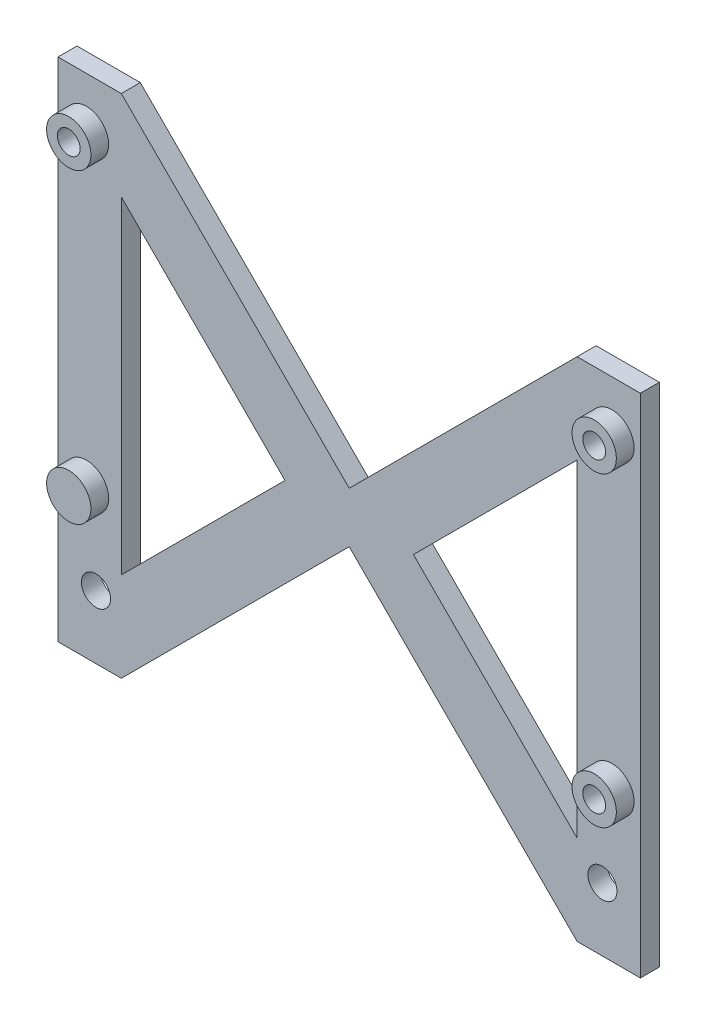
ISO-10303-21;
HEADER;
FILE_DESCRIPTION(('STEP AP214'),'2;1');
FILE_NAME('part.step','',(''),(''),'','','');
FILE_SCHEMA(('AUTOMOTIVE_DESIGN { 1 0 10303 214 1 1 1 1 }'));
ENDSEC;
DATA;
#1=APPLICATION_CONTEXT('core data for automotive mechanical design processes');
#2=APPLICATION_PROTOCOL_DEFINITION('international standard','automotive_design',2000,#1);
#3=PRODUCT_CONTEXT('',#1,'mechanical');
#4=PRODUCT('Part','Part','',(#3));
#5=PRODUCT_RELATED_PRODUCT_CATEGORY('part','',(#4));
#6=PRODUCT_DEFINITION_FORMATION('','',#4);
#7=PRODUCT_DEFINITION_CONTEXT('part definition',#1,'design');
#8=PRODUCT_DEFINITION('design','',#6,#7);
#9=PRODUCT_DEFINITION_SHAPE('','',#8);
#10=(LENGTH_UNIT() NAMED_UNIT(*) SI_UNIT(.MILLI.,.METRE.));
#11=(NAMED_UNIT(*) PLANE_ANGLE_UNIT() SI_UNIT($,.RADIAN.));
#12=(NAMED_UNIT(*) SI_UNIT($,.STERADIAN.) SOLID_ANGLE_UNIT());
#13=UNCERTAINTY_MEASURE_WITH_UNIT(LENGTH_MEASURE(1.E-05),#10,'distance_accuracy_value','');
#14=(GEOMETRIC_REPRESENTATION_CONTEXT(3) GLOBAL_UNCERTAINTY_ASSIGNED_CONTEXT((#13)) GLOBAL_UNIT_ASSIGNED_CONTEXT((#10,
#11,#12)) REPRESENTATION_CONTEXT('',''));
#15=CARTESIAN_POINT('',(0.,0.,0.));
#16=DIRECTION('',(0.,0.,1.));
#17=DIRECTION('',(1.,0.,0.));
#18=AXIS2_PLACEMENT_3D('',#15,#16,#17);
#19=CARTESIAN_POINT('',(-46.,-40.,3.));
#20=DIRECTION('',(0.,1.,0.));
#21=DIRECTION('',(0.,0.,1.));
#22=AXIS2_PLACEMENT_3D('',#19,#20,#21);
#23=PLANE('',#22);
#24=DIRECTION('',(1.,0.,0.));
#25=VECTOR('',#24,1.);
#26=CARTESIAN_POINT('',(-46.,-40.,0.));
#27=LINE('',#26,#25);
#28=CARTESIAN_POINT('',(-46.,-40.,0.));
#29=VERTEX_POINT('',#28);
#30=CARTESIAN_POINT('',(-36.,-40.,0.));
#31=VERTEX_POINT('',#30);
#32=EDGE_CURVE('E240',#29,#31,#27,.T.);
#33=ORIENTED_EDGE('',*,*,#32,.T.);
#34=DIRECTION('',(0.,0.,1.));
#35=VECTOR('',#34,1.);
#36=CARTESIAN_POINT('',(-36.,-40.,0.));
#37=LINE('',#36,#35);
#38=CARTESIAN_POINT('',(-36.,-40.,3.));
#39=VERTEX_POINT('',#38);
#40=EDGE_CURVE('E187',#31,#39,#37,.T.);
#41=ORIENTED_EDGE('',*,*,#40,.T.);
#42=DIRECTION('',(1.,0.,0.));
#43=VECTOR('',#42,1.);
#44=CARTESIAN_POINT('',(-46.,-40.,3.));
#45=LINE('',#44,#43);
#46=CARTESIAN_POINT('',(-46.,-40.,3.));
#47=VERTEX_POINT('',#46);
#48=EDGE_CURVE('E247',#47,#39,#45,.T.);
#49=ORIENTED_EDGE('',*,*,#48,.F.);
#50=DIRECTION('',(0.,0.,-1.));
#51=VECTOR('',#50,1.);
#52=CARTESIAN_POINT('',(-46.,-40.,3.));
#53=LINE('',#52,#51);
#54=EDGE_CURVE('E264',#47,#29,#53,.T.);
#55=ORIENTED_EDGE('',*,*,#54,.T.);
#56=EDGE_LOOP('',(#33,#41,#49,#55));
#57=FACE_BOUND('',#56,.T.);
#58=ADVANCED_FACE('F32',(#57),#23,.F.);
#59=CARTESIAN_POINT('',(-46.,40.,3.));
#60=DIRECTION('',(0.,-1.,0.));
#61=DIRECTION('',(0.,0.,-1.));
#62=AXIS2_PLACEMENT_3D('',#59,#60,#61);
#63=PLANE('',#62);
#64=DIRECTION('',(-1.,0.,0.));
#65=VECTOR('',#64,1.);
#66=CARTESIAN_POINT('',(-46.,40.,0.));
#67=LINE('',#66,#65);
#68=CARTESIAN_POINT('',(46.,40.,0.));
#69=VERTEX_POINT('',#68);
#70=CARTESIAN_POINT('',(36.,40.,0.));
#71=VERTEX_POINT('',#70);
#72=EDGE_CURVE('E254',#69,#71,#67,.T.);
#73=ORIENTED_EDGE('',*,*,#72,.T.);
#74=DIRECTION('',(0.,0.,1.));
#75=VECTOR('',#74,1.);
#76=CARTESIAN_POINT('',(36.,40.,0.));
#77=LINE('',#76,#75);
#78=CARTESIAN_POINT('',(36.,40.,3.));
#79=VERTEX_POINT('',#78);
#80=EDGE_CURVE('E229',#71,#79,#77,.T.);
#81=ORIENTED_EDGE('',*,*,#80,.T.);
#82=DIRECTION('',(-1.,0.,0.));
#83=VECTOR('',#82,1.);
#84=CARTESIAN_POINT('',(-46.,40.,3.));
#85=LINE('',#84,#83);
#86=CARTESIAN_POINT('',(46.,40.,3.));
#87=VERTEX_POINT('',#86);
#88=EDGE_CURVE('E241',#87,#79,#85,.T.);
#89=ORIENTED_EDGE('',*,*,#88,.F.);
#90=DIRECTION('',(0.,0.,-1.));
#91=VECTOR('',#90,1.);
#92=CARTESIAN_POINT('',(46.,40.,3.));
#93=LINE('',#92,#91);
#94=EDGE_CURVE('E270',#87,#69,#93,.T.);
#95=ORIENTED_EDGE('',*,*,#94,.T.);
#96=EDGE_LOOP('',(#73,#81,#89,#95));
#97=FACE_BOUND('',#96,.T.);
#98=ADVANCED_FACE('F324',(#97),#63,.F.);
#99=CARTESIAN_POINT('',(46.,-40.,3.));
#100=DIRECTION('',(-1.,0.,0.));
#101=DIRECTION('',(0.,0.,1.));
#102=AXIS2_PLACEMENT_3D('',#99,#100,#101);
#103=PLANE('',#102);
#104=DIRECTION('',(0.,1.,0.));
#105=VECTOR('',#104,1.);
#106=CARTESIAN_POINT('',(46.,-40.,0.));
#107=LINE('',#106,#105);
#108=CARTESIAN_POINT('',(46.,-40.,0.));
#109=VERTEX_POINT('',#108);
#110=EDGE_CURVE('E232',#109,#69,#107,.T.);
#111=ORIENTED_EDGE('',*,*,#110,.T.);
#112=ORIENTED_EDGE('',*,*,#94,.F.);
#113=DIRECTION('',(0.,1.,0.));
#114=VECTOR('',#113,1.);
#115=CARTESIAN_POINT('',(46.,-40.,3.));
#116=LINE('',#115,#114);
#117=CARTESIAN_POINT('',(46.,-40.,3.));
#118=VERTEX_POINT('',#117);
#119=EDGE_CURVE('E236',#118,#87,#116,.T.);
#120=ORIENTED_EDGE('',*,*,#119,.F.);
#121=DIRECTION('',(0.,0.,-1.));
#122=VECTOR('',#121,1.);
#123=CARTESIAN_POINT('',(46.,-40.,3.));
#124=LINE('',#123,#122);
#125=EDGE_CURVE('E250',#118,#109,#124,.T.);
#126=ORIENTED_EDGE('',*,*,#125,.T.);
#127=EDGE_LOOP('',(#111,#112,#120,#126));
#128=FACE_BOUND('',#127,.T.);
#129=ADVANCED_FACE('F34',(#128),#103,.F.);
#130=CARTESIAN_POINT('',(-36.,40.,3.));
#131=VERTEX_POINT('',#130);
#132=CARTESIAN_POINT('',(-46.,40.,3.));
#133=VERTEX_POINT('',#132);
#134=EDGE_CURVE('E239',#131,#133,#85,.T.);
#135=ORIENTED_EDGE('',*,*,#134,.F.);
#136=DIRECTION('',(0.,0.,1.));
#137=VECTOR('',#136,1.);
#138=CARTESIAN_POINT('',(-36.,40.,0.));
#139=LINE('',#138,#137);
#140=CARTESIAN_POINT('',(-36.,40.,0.));
#141=VERTEX_POINT('',#140);
#142=EDGE_CURVE('E225',#141,#131,#139,.T.);
#143=ORIENTED_EDGE('',*,*,#142,.F.);
#144=CARTESIAN_POINT('',(-46.,40.,0.));
#145=VERTEX_POINT('',#144);
#146=EDGE_CURVE('E253',#141,#145,#67,.T.);
#147=ORIENTED_EDGE('',*,*,#146,.T.);
#148=DIRECTION('',(0.,0.,-1.));
#149=VECTOR('',#148,1.);
#150=CARTESIAN_POINT('',(-46.,40.,3.));
#151=LINE('',#150,#149);
#152=EDGE_CURVE('E267',#133,#145,#151,.T.);
#153=ORIENTED_EDGE('',*,*,#152,.F.);
#154=EDGE_LOOP('',(#135,#143,#147,#153));
#155=FACE_BOUND('',#154,.T.);
#156=ADVANCED_FACE('F335',(#155),#63,.F.);
#157=CARTESIAN_POINT('',(-46.,-40.,3.));
#158=DIRECTION('',(1.,0.,0.));
#159=DIRECTION('',(0.,0.,-1.));
#160=AXIS2_PLACEMENT_3D('',#157,#158,#159);
#161=PLANE('',#160);
#162=DIRECTION('',(0.,-1.,0.));
#163=VECTOR('',#162,1.);
#164=CARTESIAN_POINT('',(-46.,-40.,0.));
#165=LINE('',#164,#163);
#166=EDGE_CURVE('E257',#145,#29,#165,.T.);
#167=ORIENTED_EDGE('',*,*,#166,.T.);
#168=ORIENTED_EDGE('',*,*,#54,.F.);
#169=DIRECTION('',(0.,-1.,0.));
#170=VECTOR('',#169,1.);
#171=CARTESIAN_POINT('',(-46.,-40.,3.));
#172=LINE('',#171,#170);
#173=EDGE_CURVE('E244',#133,#47,#172,.T.);
#174=ORIENTED_EDGE('',*,*,#173,.F.);
#175=ORIENTED_EDGE('',*,*,#152,.T.);
#176=EDGE_LOOP('',(#167,#168,#174,#175));
#177=FACE_BOUND('',#176,.T.);
#178=ADVANCED_FACE('F338',(#177),#161,.F.);
#179=CARTESIAN_POINT('',(36.,-40.,3.));
#180=VERTEX_POINT('',#179);
#181=EDGE_CURVE('E246',#180,#118,#45,.T.);
#182=ORIENTED_EDGE('',*,*,#181,.F.);
#183=DIRECTION('',(0.,0.,1.));
#184=VECTOR('',#183,1.);
#185=CARTESIAN_POINT('',(36.,-40.,0.));
#186=LINE('',#185,#184);
#187=CARTESIAN_POINT('',(36.,-40.,0.));
#188=VERTEX_POINT('',#187);
#189=EDGE_CURVE('E183',#188,#180,#186,.T.);
#190=ORIENTED_EDGE('',*,*,#189,.F.);
#191=EDGE_CURVE('E259',#188,#109,#27,.T.);
#192=ORIENTED_EDGE('',*,*,#191,.T.);
#193=ORIENTED_EDGE('',*,*,#125,.F.);
#194=EDGE_LOOP('',(#182,#190,#192,#193));
#195=FACE_BOUND('',#194,.T.);
#196=ADVANCED_FACE('F286',(#195),#23,.F.);
#197=CARTESIAN_POINT('',(0.,0.,3.));
#198=DIRECTION('',(0.,0.,-1.));
#199=DIRECTION('',(-1.,0.,0.));
#200=AXIS2_PLACEMENT_3D('',#197,#198,#199);
#201=PLANE('',#200);
#202=CARTESIAN_POINT('',(40.,-30.,3.));
#203=DIRECTION('',(0.,0.,1.));
#204=DIRECTION('',(1.,0.,0.));
#205=AXIS2_PLACEMENT_3D('',#202,#203,#204);
#206=CIRCLE('',#205,2.3);
#207=CARTESIAN_POINT('',(42.3,-30.,3.));
#208=VERTEX_POINT('',#207);
#209=EDGE_CURVE('E439',#208,#208,#206,.T.);
#210=ORIENTED_EDGE('',*,*,#209,.F.);
#211=EDGE_LOOP('',(#210));
#212=FACE_BOUND('',#211,.T.);
#213=CARTESIAN_POINT('',(-40.,-30.,3.));
#214=DIRECTION('',(0.,0.,1.));
#215=DIRECTION('',(1.,0.,0.));
#216=AXIS2_PLACEMENT_3D('',#213,#214,#215);
#217=CIRCLE('',#216,2.30000000000001);
#218=CARTESIAN_POINT('',(-37.7,-30.,3.));
#219=VERTEX_POINT('',#218);
#220=EDGE_CURVE('E441',#219,#219,#217,.T.);
#221=ORIENTED_EDGE('',*,*,#220,.F.);
#222=EDGE_LOOP('',(#221));
#223=FACE_BOUND('',#222,.T.);
#224=CARTESIAN_POINT('',(41.5,32.,3.));
#225=DIRECTION('',(0.,0.,-1.));
#226=DIRECTION('',(-1.,0.,0.));
#227=AXIS2_PLACEMENT_3D('',#224,#225,#226);
#228=CIRCLE('',#227,3.5);
#229=CARTESIAN_POINT('',(38.,32.,3.));
#230=VERTEX_POINT('',#229);
#231=EDGE_CURVE('E11',#230,#230,#228,.F.);
#232=ORIENTED_EDGE('',*,*,#231,.F.);
#233=EDGE_LOOP('',(#232));
#234=FACE_BOUND('',#233,.T.);
#235=CARTESIAN_POINT('',(41.5,-16.4,3.));
#236=DIRECTION('',(0.,0.,-1.));
#237=DIRECTION('',(-1.,0.,0.));
#238=AXIS2_PLACEMENT_3D('',#235,#236,#237);
#239=CIRCLE('',#238,3.5);
#240=CARTESIAN_POINT('',(38.,-16.4,3.));
#241=VERTEX_POINT('',#240);
#242=EDGE_CURVE('E40',#241,#241,#239,.F.);
#243=ORIENTED_EDGE('',*,*,#242,.F.);
#244=EDGE_LOOP('',(#243));
#245=FACE_BOUND('',#244,.T.);
#246=CARTESIAN_POINT('',(-41.5,-16.4,3.));
#247=DIRECTION('',(0.,0.,-1.));
#248=DIRECTION('',(-1.,0.,0.));
#249=AXIS2_PLACEMENT_3D('',#246,#247,#248);
#250=CIRCLE('',#249,3.5);
#251=CARTESIAN_POINT('',(-45.,-16.4,3.));
#252=VERTEX_POINT('',#251);
#253=EDGE_CURVE('E276',#252,#252,#250,.F.);
#254=ORIENTED_EDGE('',*,*,#253,.F.);
#255=EDGE_LOOP('',(#254));
#256=FACE_BOUND('',#255,.T.);
#257=CARTESIAN_POINT('',(-41.5,32.,3.));
#258=DIRECTION('',(0.,0.,-1.));
#259=DIRECTION('',(-1.,0.,0.));
#260=AXIS2_PLACEMENT_3D('',#257,#258,#259);
#261=CIRCLE('',#260,3.5);
#262=CARTESIAN_POINT('',(-45.,32.,3.));
#263=VERTEX_POINT('',#262);
#264=EDGE_CURVE('E273',#263,#263,#261,.F.);
#265=ORIENTED_EDGE('',*,*,#264,.F.);
#266=EDGE_LOOP('',(#265));
#267=FACE_BOUND('',#266,.T.);
#268=DIRECTION('',(0.707106781186548,-0.707106781186548,0.));
#269=VECTOR('',#268,1.);
#270=CARTESIAN_POINT('',(36.,-25.8578643762691,3.));
#271=LINE('',#270,#269);
#272=CARTESIAN_POINT('',(10.1421356237309,0.,3.));
#273=VERTEX_POINT('',#272);
#274=CARTESIAN_POINT('',(36.,-25.8578643762691,3.));
#275=VERTEX_POINT('',#274);
#276=EDGE_CURVE('E163',#273,#275,#271,.T.);
#277=ORIENTED_EDGE('',*,*,#276,.F.);
#278=DIRECTION('',(-0.707106781186547,-0.707106781186548,0.));
#279=VECTOR('',#278,1.);
#280=CARTESIAN_POINT('',(10.1421356237309,0.,3.));
#281=LINE('',#280,#279);
#282=CARTESIAN_POINT('',(36.,25.857864376269,3.));
#283=VERTEX_POINT('',#282);
#284=EDGE_CURVE('E47',#283,#273,#281,.T.);
#285=ORIENTED_EDGE('',*,*,#284,.F.);
#286=DIRECTION('',(0.,1.,0.));
#287=VECTOR('',#286,1.);
#288=CARTESIAN_POINT('',(36.,25.857864376269,3.));
#289=LINE('',#288,#287);
#290=EDGE_CURVE('E160',#275,#283,#289,.T.);
#291=ORIENTED_EDGE('',*,*,#290,.F.);
#292=EDGE_LOOP('',(#277,#285,#291));
#293=FACE_BOUND('',#292,.T.);
#294=DIRECTION('',(0.,-1.,0.));
#295=VECTOR('',#294,1.);
#296=CARTESIAN_POINT('',(-36.,25.857864376269,3.));
#297=LINE('',#296,#295);
#298=CARTESIAN_POINT('',(-36.,25.857864376269,3.));
#299=VERTEX_POINT('',#298);
#300=CARTESIAN_POINT('',(-36.,-25.857864376269,3.));
#301=VERTEX_POINT('',#300);
#302=EDGE_CURVE('E206',#299,#301,#297,.T.);
#303=ORIENTED_EDGE('',*,*,#302,.F.);
#304=DIRECTION('',(-0.707106781186548,0.707106781186547,0.));
#305=VECTOR('',#304,1.);
#306=CARTESIAN_POINT('',(-10.142135623731,0.,3.));
#307=LINE('',#306,#305);
#308=CARTESIAN_POINT('',(-10.142135623731,0.,3.));
#309=VERTEX_POINT('',#308);
#310=EDGE_CURVE('E190',#309,#299,#307,.T.);
#311=ORIENTED_EDGE('',*,*,#310,.F.);
#312=DIRECTION('',(0.707106781186548,0.707106781186548,0.));
#313=VECTOR('',#312,1.);
#314=CARTESIAN_POINT('',(-36.,-25.857864376269,3.));
#315=LINE('',#314,#313);
#316=EDGE_CURVE('E198',#301,#309,#315,.T.);
#317=ORIENTED_EDGE('',*,*,#316,.F.);
#318=EDGE_LOOP('',(#303,#311,#317));
#319=FACE_BOUND('',#318,.T.);
#320=ORIENTED_EDGE('',*,*,#48,.T.);
#321=DIRECTION('',(-0.707106781186547,-0.707106781186548,0.));
#322=VECTOR('',#321,1.);
#323=CARTESIAN_POINT('',(-36.,-40.,3.));
#324=LINE('',#323,#322);
#325=CARTESIAN_POINT('',(0.,-4.00000000000001,3.));
#326=VERTEX_POINT('',#325);
#327=EDGE_CURVE('E180',#326,#39,#324,.T.);
#328=ORIENTED_EDGE('',*,*,#327,.F.);
#329=DIRECTION('',(-0.707106781186547,0.707106781186548,0.));
#330=VECTOR('',#329,1.);
#331=CARTESIAN_POINT('',(0.,-4.00000000000001,3.));
#332=LINE('',#331,#330);
#333=EDGE_CURVE('E174',#180,#326,#332,.T.);
#334=ORIENTED_EDGE('',*,*,#333,.F.);
#335=ORIENTED_EDGE('',*,*,#181,.T.);
#336=ORIENTED_EDGE('',*,*,#119,.T.);
#337=ORIENTED_EDGE('',*,*,#88,.T.);
#338=DIRECTION('',(0.707106781186547,0.707106781186548,0.));
#339=VECTOR('',#338,1.);
#340=CARTESIAN_POINT('',(0.,3.99999999999998,3.));
#341=LINE('',#340,#339);
#342=CARTESIAN_POINT('',(0.,3.99999999999998,3.));
#343=VERTEX_POINT('',#342);
#344=EDGE_CURVE('E222',#343,#79,#341,.T.);
#345=ORIENTED_EDGE('',*,*,#344,.F.);
#346=DIRECTION('',(0.707106781186547,-0.707106781186548,0.));
#347=VECTOR('',#346,1.);
#348=CARTESIAN_POINT('',(-36.,40.,3.));
#349=LINE('',#348,#347);
#350=EDGE_CURVE('E213',#131,#343,#349,.T.);
#351=ORIENTED_EDGE('',*,*,#350,.F.);
#352=ORIENTED_EDGE('',*,*,#134,.T.);
#353=ORIENTED_EDGE('',*,*,#173,.T.);
#354=EDGE_LOOP('',(#320,#328,#334,#335,#336,#337,#345,#351,#352,#353));
#355=FACE_BOUND('',#354,.T.);
#356=ADVANCED_FACE('F283',(#212,#223,#234,#245,#256,#267,#293,#319,#355),#201,.F.);
#357=CARTESIAN_POINT('',(0.,0.,0.));
#358=DIRECTION('',(0.,0.,-1.));
#359=DIRECTION('',(-1.,0.,0.));
#360=AXIS2_PLACEMENT_3D('',#357,#358,#359);
#361=PLANE('',#360);
#362=CARTESIAN_POINT('',(40.,-30.,0.));
#363=DIRECTION('',(0.,0.,1.));
#364=DIRECTION('',(1.,0.,0.));
#365=AXIS2_PLACEMENT_3D('',#362,#363,#364);
#366=CIRCLE('',#365,2.3);
#367=CARTESIAN_POINT('',(42.3,-30.,0.));
#368=VERTEX_POINT('',#367);
#369=EDGE_CURVE('E436',#368,#368,#366,.T.);
#370=ORIENTED_EDGE('',*,*,#369,.T.);
#371=EDGE_LOOP('',(#370));
#372=FACE_BOUND('',#371,.T.);
#373=CARTESIAN_POINT('',(-40.,-30.,0.));
#374=DIRECTION('',(0.,0.,1.));
#375=DIRECTION('',(1.,0.,0.));
#376=AXIS2_PLACEMENT_3D('',#373,#374,#375);
#377=CIRCLE('',#376,2.30000000000001);
#378=CARTESIAN_POINT('',(-37.7,-30.,0.));
#379=VERTEX_POINT('',#378);
#380=EDGE_CURVE('E444',#379,#379,#377,.T.);
#381=ORIENTED_EDGE('',*,*,#380,.T.);
#382=EDGE_LOOP('',(#381));
#383=FACE_BOUND('',#382,.T.);
#384=CARTESIAN_POINT('',(41.5,-16.4,0.));
#385=DIRECTION('',(0.,0.,1.));
#386=DIRECTION('',(1.,0.,0.));
#387=AXIS2_PLACEMENT_3D('',#384,#385,#386);
#388=CIRCLE('',#387,1.8);
#389=CARTESIAN_POINT('',(43.3,-16.4,0.));
#390=VERTEX_POINT('',#389);
#391=EDGE_CURVE('E450',#390,#390,#388,.T.);
#392=ORIENTED_EDGE('',*,*,#391,.T.);
#393=EDGE_LOOP('',(#392));
#394=FACE_BOUND('',#393,.T.);
#395=CARTESIAN_POINT('',(41.5,32.,0.));
#396=DIRECTION('',(0.,0.,1.));
#397=DIRECTION('',(1.,0.,0.));
#398=AXIS2_PLACEMENT_3D('',#395,#396,#397);
#399=CIRCLE('',#398,1.8);
#400=CARTESIAN_POINT('',(43.3,32.,0.));
#401=VERTEX_POINT('',#400);
#402=EDGE_CURVE('E456',#401,#401,#399,.T.);
#403=ORIENTED_EDGE('',*,*,#402,.T.);
#404=EDGE_LOOP('',(#403));
#405=FACE_BOUND('',#404,.T.);
#406=CARTESIAN_POINT('',(-41.5,32.,0.));
#407=DIRECTION('',(0.,0.,1.));
#408=DIRECTION('',(1.,0.,0.));
#409=AXIS2_PLACEMENT_3D('',#406,#407,#408);
#410=CIRCLE('',#409,1.8);
#411=CARTESIAN_POINT('',(-39.7,32.,0.));
#412=VERTEX_POINT('',#411);
#413=EDGE_CURVE('E462',#412,#412,#410,.T.);
#414=ORIENTED_EDGE('',*,*,#413,.T.);
#415=EDGE_LOOP('',(#414));
#416=FACE_BOUND('',#415,.T.);
#417=DIRECTION('',(-0.707106781186547,-0.707106781186548,0.));
#418=VECTOR('',#417,1.);
#419=CARTESIAN_POINT('',(10.1421356237309,0.,0.));
#420=LINE('',#419,#418);
#421=CARTESIAN_POINT('',(36.,25.857864376269,0.));
#422=VERTEX_POINT('',#421);
#423=CARTESIAN_POINT('',(10.1421356237309,0.,0.));
#424=VERTEX_POINT('',#423);
#425=EDGE_CURVE('E147',#422,#424,#420,.T.);
#426=ORIENTED_EDGE('',*,*,#425,.T.);
#427=DIRECTION('',(0.707106781186548,-0.707106781186548,0.));
#428=VECTOR('',#427,1.);
#429=CARTESIAN_POINT('',(36.,-25.8578643762691,0.));
#430=LINE('',#429,#428);
#431=CARTESIAN_POINT('',(36.,-25.8578643762691,0.));
#432=VERTEX_POINT('',#431);
#433=EDGE_CURVE('E154',#424,#432,#430,.T.);
#434=ORIENTED_EDGE('',*,*,#433,.T.);
#435=DIRECTION('',(0.,1.,0.));
#436=VECTOR('',#435,1.);
#437=CARTESIAN_POINT('',(36.,25.857864376269,0.));
#438=LINE('',#437,#436);
#439=EDGE_CURVE('E55',#432,#422,#438,.T.);
#440=ORIENTED_EDGE('',*,*,#439,.T.);
#441=EDGE_LOOP('',(#426,#434,#440));
#442=FACE_BOUND('',#441,.T.);
#443=DIRECTION('',(-0.707106781186547,-0.707106781186548,0.));
#444=VECTOR('',#443,1.);
#445=CARTESIAN_POINT('',(-36.,-40.,0.));
#446=LINE('',#445,#444);
#447=CARTESIAN_POINT('',(0.,-4.00000000000001,0.));
#448=VERTEX_POINT('',#447);
#449=EDGE_CURVE('E179',#448,#31,#446,.T.);
#450=ORIENTED_EDGE('',*,*,#449,.T.);
#451=ORIENTED_EDGE('',*,*,#32,.F.);
#452=ORIENTED_EDGE('',*,*,#166,.F.);
#453=ORIENTED_EDGE('',*,*,#146,.F.);
#454=DIRECTION('',(0.707106781186547,-0.707106781186548,0.));
#455=VECTOR('',#454,1.);
#456=CARTESIAN_POINT('',(-36.,40.,0.));
#457=LINE('',#456,#455);
#458=CARTESIAN_POINT('',(0.,3.99999999999998,0.));
#459=VERTEX_POINT('',#458);
#460=EDGE_CURVE('E218',#141,#459,#457,.T.);
#461=ORIENTED_EDGE('',*,*,#460,.T.);
#462=DIRECTION('',(0.707106781186547,0.707106781186548,0.));
#463=VECTOR('',#462,1.);
#464=CARTESIAN_POINT('',(0.,3.99999999999998,0.));
#465=LINE('',#464,#463);
#466=EDGE_CURVE('E221',#459,#71,#465,.T.);
#467=ORIENTED_EDGE('',*,*,#466,.T.);
#468=ORIENTED_EDGE('',*,*,#72,.F.);
#469=ORIENTED_EDGE('',*,*,#110,.F.);
#470=ORIENTED_EDGE('',*,*,#191,.F.);
#471=DIRECTION('',(-0.707106781186547,0.707106781186548,0.));
#472=VECTOR('',#471,1.);
#473=CARTESIAN_POINT('',(0.,-4.00000000000001,0.));
#474=LINE('',#473,#472);
#475=EDGE_CURVE('E176',#188,#448,#474,.T.);
#476=ORIENTED_EDGE('',*,*,#475,.T.);
#477=EDGE_LOOP('',(#450,#451,#452,#453,#461,#467,#468,#469,#470,#476));
#478=FACE_BOUND('',#477,.T.);
#479=DIRECTION('',(-0.707106781186548,0.707106781186547,0.));
#480=VECTOR('',#479,1.);
#481=CARTESIAN_POINT('',(-10.142135623731,0.,0.));
#482=LINE('',#481,#480);
#483=CARTESIAN_POINT('',(-10.142135623731,0.,0.));
#484=VERTEX_POINT('',#483);
#485=CARTESIAN_POINT('',(-36.,25.857864376269,0.));
#486=VERTEX_POINT('',#485);
#487=EDGE_CURVE('E194',#484,#486,#482,.T.);
#488=ORIENTED_EDGE('',*,*,#487,.T.);
#489=DIRECTION('',(0.,-1.,0.));
#490=VECTOR('',#489,1.);
#491=CARTESIAN_POINT('',(-36.,25.857864376269,0.));
#492=LINE('',#491,#490);
#493=CARTESIAN_POINT('',(-36.,-25.857864376269,0.));
#494=VERTEX_POINT('',#493);
#495=EDGE_CURVE('E197',#486,#494,#492,.T.);
#496=ORIENTED_EDGE('',*,*,#495,.T.);
#497=DIRECTION('',(0.707106781186548,0.707106781186548,0.));
#498=VECTOR('',#497,1.);
#499=CARTESIAN_POINT('',(-36.,-25.857864376269,0.));
#500=LINE('',#499,#498);
#501=EDGE_CURVE('E201',#494,#484,#500,.T.);
#502=ORIENTED_EDGE('',*,*,#501,.T.);
#503=EDGE_LOOP('',(#488,#496,#502));
#504=FACE_BOUND('',#503,.T.);
#505=ADVANCED_FACE('F158',(#372,#383,#394,#405,#416,#442,#478,#504),#361,.T.);
#506=CARTESIAN_POINT('',(0.,3.99999999999998,0.));
#507=DIRECTION('',(0.707106781186548,-0.707106781186547,0.));
#508=DIRECTION('',(0.707106781186547,0.707106781186548,0.));
#509=AXIS2_PLACEMENT_3D('',#506,#507,#508);
#510=PLANE('',#509);
#511=ORIENTED_EDGE('',*,*,#344,.T.);
#512=ORIENTED_EDGE('',*,*,#80,.F.);
#513=ORIENTED_EDGE('',*,*,#466,.F.);
#514=DIRECTION('',(0.,0.,1.));
#515=VECTOR('',#514,1.);
#516=CARTESIAN_POINT('',(0.,3.99999999999998,0.));
#517=LINE('',#516,#515);
#518=EDGE_CURVE('E233',#459,#343,#517,.T.);
#519=ORIENTED_EDGE('',*,*,#518,.T.);
#520=EDGE_LOOP('',(#511,#512,#513,#519));
#521=FACE_BOUND('',#520,.T.);
#522=ADVANCED_FACE('F326',(#521),#510,.F.);
#523=CARTESIAN_POINT('',(-36.,40.,0.));
#524=DIRECTION('',(-0.707106781186548,-0.707106781186547,0.));
#525=DIRECTION('',(0.707106781186547,-0.707106781186548,0.));
#526=AXIS2_PLACEMENT_3D('',#523,#524,#525);
#527=PLANE('',#526);
#528=ORIENTED_EDGE('',*,*,#350,.T.);
#529=ORIENTED_EDGE('',*,*,#518,.F.);
#530=ORIENTED_EDGE('',*,*,#460,.F.);
#531=ORIENTED_EDGE('',*,*,#142,.T.);
#532=EDGE_LOOP('',(#528,#529,#530,#531));
#533=FACE_BOUND('',#532,.T.);
#534=ADVANCED_FACE('F331',(#533),#527,.F.);
#535=CARTESIAN_POINT('',(-10.142135623731,0.,0.));
#536=DIRECTION('',(0.707106781186547,0.707106781186548,0.));
#537=DIRECTION('',(-0.707106781186548,0.707106781186547,0.));
#538=AXIS2_PLACEMENT_3D('',#535,#536,#537);
#539=PLANE('',#538);
#540=ORIENTED_EDGE('',*,*,#310,.T.);
#541=DIRECTION('',(0.,0.,1.));
#542=VECTOR('',#541,1.);
#543=CARTESIAN_POINT('',(-36.,25.857864376269,0.));
#544=LINE('',#543,#542);
#545=EDGE_CURVE('E204',#486,#299,#544,.T.);
#546=ORIENTED_EDGE('',*,*,#545,.F.);
#547=ORIENTED_EDGE('',*,*,#487,.F.);
#548=DIRECTION('',(0.,0.,1.));
#549=VECTOR('',#548,1.);
#550=CARTESIAN_POINT('',(-10.142135623731,0.,0.));
#551=LINE('',#550,#549);
#552=EDGE_CURVE('E211',#484,#309,#551,.T.);
#553=ORIENTED_EDGE('',*,*,#552,.T.);
#554=EDGE_LOOP('',(#540,#546,#547,#553));
#555=FACE_BOUND('',#554,.T.);
#556=ADVANCED_FACE('F356',(#555),#539,.F.);
#557=CARTESIAN_POINT('',(-36.,-25.857864376269,0.));
#558=DIRECTION('',(0.707106781186547,-0.707106781186547,0.));
#559=DIRECTION('',(0.707106781186548,0.707106781186548,0.));
#560=AXIS2_PLACEMENT_3D('',#557,#558,#559);
#561=PLANE('',#560);
#562=ORIENTED_EDGE('',*,*,#316,.T.);
#563=ORIENTED_EDGE('',*,*,#552,.F.);
#564=ORIENTED_EDGE('',*,*,#501,.F.);
#565=DIRECTION('',(0.,0.,1.));
#566=VECTOR('',#565,1.);
#567=CARTESIAN_POINT('',(-36.,-25.857864376269,0.));
#568=LINE('',#567,#566);
#569=EDGE_CURVE('E214',#494,#301,#568,.T.);
#570=ORIENTED_EDGE('',*,*,#569,.T.);
#571=EDGE_LOOP('',(#562,#563,#564,#570));
#572=FACE_BOUND('',#571,.T.);
#573=ADVANCED_FACE('F361',(#572),#561,.F.);
#574=CARTESIAN_POINT('',(-36.,25.857864376269,0.));
#575=DIRECTION('',(-1.,0.,0.));
#576=DIRECTION('',(0.,-1.,0.));
#577=AXIS2_PLACEMENT_3D('',#574,#575,#576);
#578=PLANE('',#577);
#579=ORIENTED_EDGE('',*,*,#302,.T.);
#580=ORIENTED_EDGE('',*,*,#569,.F.);
#581=ORIENTED_EDGE('',*,*,#495,.F.);
#582=ORIENTED_EDGE('',*,*,#545,.T.);
#583=EDGE_LOOP('',(#579,#580,#581,#582));
#584=FACE_BOUND('',#583,.T.);
#585=ADVANCED_FACE('F363',(#584),#578,.F.);
#586=CARTESIAN_POINT('',(-36.,-40.,0.));
#587=DIRECTION('',(-0.707106781186548,0.707106781186547,0.));
#588=DIRECTION('',(-0.707106781186547,-0.707106781186548,0.));
#589=AXIS2_PLACEMENT_3D('',#586,#587,#588);
#590=PLANE('',#589);
#591=ORIENTED_EDGE('',*,*,#327,.T.);
#592=ORIENTED_EDGE('',*,*,#40,.F.);
#593=ORIENTED_EDGE('',*,*,#449,.F.);
#594=DIRECTION('',(0.,0.,1.));
#595=VECTOR('',#594,1.);
#596=CARTESIAN_POINT('',(0.,-4.00000000000001,0.));
#597=LINE('',#596,#595);
#598=EDGE_CURVE('E191',#448,#326,#597,.T.);
#599=ORIENTED_EDGE('',*,*,#598,.T.);
#600=EDGE_LOOP('',(#591,#592,#593,#599));
#601=FACE_BOUND('',#600,.T.);
#602=ADVANCED_FACE('F307',(#601),#590,.F.);
#603=CARTESIAN_POINT('',(0.,-4.00000000000001,0.));
#604=DIRECTION('',(0.707106781186548,0.707106781186547,0.));
#605=DIRECTION('',(-0.707106781186547,0.707106781186548,0.));
#606=AXIS2_PLACEMENT_3D('',#603,#604,#605);
#607=PLANE('',#606);
#608=ORIENTED_EDGE('',*,*,#333,.T.);
#609=ORIENTED_EDGE('',*,*,#598,.F.);
#610=ORIENTED_EDGE('',*,*,#475,.F.);
#611=ORIENTED_EDGE('',*,*,#189,.T.);
#612=EDGE_LOOP('',(#608,#609,#610,#611));
#613=FACE_BOUND('',#612,.T.);
#614=ADVANCED_FACE('F315',(#613),#607,.F.);
#615=CARTESIAN_POINT('',(10.1421356237309,0.,0.));
#616=DIRECTION('',(-0.707106781186548,0.707106781186547,0.));
#617=DIRECTION('',(-0.707106781186547,-0.707106781186548,0.));
#618=AXIS2_PLACEMENT_3D('',#615,#616,#617);
#619=PLANE('',#618);
#620=ORIENTED_EDGE('',*,*,#284,.T.);
#621=DIRECTION('',(0.,0.,1.));
#622=VECTOR('',#621,1.);
#623=CARTESIAN_POINT('',(10.1421356237309,0.,0.));
#624=LINE('',#623,#622);
#625=EDGE_CURVE('E143',#424,#273,#624,.T.);
#626=ORIENTED_EDGE('',*,*,#625,.F.);
#627=ORIENTED_EDGE('',*,*,#425,.F.);
#628=DIRECTION('',(0.,0.,1.));
#629=VECTOR('',#628,1.);
#630=CARTESIAN_POINT('',(36.,25.857864376269,0.));
#631=LINE('',#630,#629);
#632=EDGE_CURVE('E172',#422,#283,#631,.T.);
#633=ORIENTED_EDGE('',*,*,#632,.T.);
#634=EDGE_LOOP('',(#620,#626,#627,#633));
#635=FACE_BOUND('',#634,.T.);
#636=ADVANCED_FACE('F145',(#635),#619,.F.);
#637=CARTESIAN_POINT('',(36.,25.857864376269,0.));
#638=DIRECTION('',(1.,0.,0.));
#639=DIRECTION('',(0.,0.,-1.));
#640=AXIS2_PLACEMENT_3D('',#637,#638,#639);
#641=PLANE('',#640);
#642=ORIENTED_EDGE('',*,*,#290,.T.);
#643=ORIENTED_EDGE('',*,*,#632,.F.);
#644=ORIENTED_EDGE('',*,*,#439,.F.);
#645=DIRECTION('',(0.,0.,1.));
#646=VECTOR('',#645,1.);
#647=CARTESIAN_POINT('',(36.,-25.8578643762691,0.));
#648=LINE('',#647,#646);
#649=EDGE_CURVE('E151',#432,#275,#648,.T.);
#650=ORIENTED_EDGE('',*,*,#649,.T.);
#651=EDGE_LOOP('',(#642,#643,#644,#650));
#652=FACE_BOUND('',#651,.T.);
#653=ADVANCED_FACE('F376',(#652),#641,.F.);
#654=CARTESIAN_POINT('',(36.,-25.8578643762691,0.));
#655=DIRECTION('',(-0.707106781186547,-0.707106781186547,0.));
#656=DIRECTION('',(0.707106781186548,-0.707106781186548,0.));
#657=AXIS2_PLACEMENT_3D('',#654,#655,#656);
#658=PLANE('',#657);
#659=ORIENTED_EDGE('',*,*,#276,.T.);
#660=ORIENTED_EDGE('',*,*,#649,.F.);
#661=ORIENTED_EDGE('',*,*,#433,.F.);
#662=ORIENTED_EDGE('',*,*,#625,.T.);
#663=EDGE_LOOP('',(#659,#660,#661,#662));
#664=FACE_BOUND('',#663,.T.);
#665=ADVANCED_FACE('F155',(#664),#658,.F.);
#666=CARTESIAN_POINT('',(-41.5,32.,5.8));
#667=DIRECTION('',(0.,0.,-1.));
#668=DIRECTION('',(-1.,0.,0.));
#669=AXIS2_PLACEMENT_3D('',#666,#667,#668);
#670=CYLINDRICAL_SURFACE('',#669,3.5);
#671=CARTESIAN_POINT('',(-41.5,32.,5.8));
#672=DIRECTION('',(0.,0.,1.));
#673=DIRECTION('',(1.,0.,0.));
#674=AXIS2_PLACEMENT_3D('',#671,#672,#673);
#675=CIRCLE('',#674,3.5);
#676=CARTESIAN_POINT('',(-38.,32.,5.8));
#677=VERTEX_POINT('',#676);
#678=EDGE_CURVE('E166',#677,#677,#675,.T.);
#679=ORIENTED_EDGE('',*,*,#678,.F.);
#680=EDGE_LOOP('',(#679));
#681=FACE_BOUND('',#680,.T.);
#682=ORIENTED_EDGE('',*,*,#264,.T.);
#683=EDGE_LOOP('',(#682));
#684=FACE_BOUND('',#683,.T.);
#685=ADVANCED_FACE('F379',(#681,#684),#670,.T.);
#686=CARTESIAN_POINT('',(-41.5,32.,5.8));
#687=DIRECTION('',(0.,0.,1.));
#688=DIRECTION('',(1.,0.,0.));
#689=AXIS2_PLACEMENT_3D('',#686,#687,#688);
#690=PLANE('',#689);
#691=CARTESIAN_POINT('',(-41.5,32.,5.8));
#692=DIRECTION('',(0.,0.,1.));
#693=DIRECTION('',(1.,0.,0.));
#694=AXIS2_PLACEMENT_3D('',#691,#692,#693);
#695=CIRCLE('',#694,1.8);
#696=CARTESIAN_POINT('',(-39.7,32.,5.8));
#697=VERTEX_POINT('',#696);
#698=EDGE_CURVE('E459',#697,#697,#695,.T.);
#699=ORIENTED_EDGE('',*,*,#698,.F.);
#700=EDGE_LOOP('',(#699));
#701=FACE_BOUND('',#700,.T.);
#702=ORIENTED_EDGE('',*,*,#678,.T.);
#703=EDGE_LOOP('',(#702));
#704=FACE_BOUND('',#703,.T.);
#705=ADVANCED_FACE('F384',(#701,#704),#690,.T.);
#706=CARTESIAN_POINT('',(-41.5,-16.4,5.8));
#707=DIRECTION('',(0.,0.,-1.));
#708=DIRECTION('',(-1.,0.,0.));
#709=AXIS2_PLACEMENT_3D('',#706,#707,#708);
#710=CYLINDRICAL_SURFACE('',#709,3.5);
#711=CARTESIAN_POINT('',(-41.5,-16.4,5.8));
#712=DIRECTION('',(0.,0.,1.));
#713=DIRECTION('',(1.,0.,0.));
#714=AXIS2_PLACEMENT_3D('',#711,#712,#713);
#715=CIRCLE('',#714,3.5);
#716=CARTESIAN_POINT('',(-38.,-16.4,5.8));
#717=VERTEX_POINT('',#716);
#718=EDGE_CURVE('E472',#717,#717,#715,.T.);
#719=ORIENTED_EDGE('',*,*,#718,.F.);
#720=EDGE_LOOP('',(#719));
#721=FACE_BOUND('',#720,.T.);
#722=ORIENTED_EDGE('',*,*,#253,.T.);
#723=EDGE_LOOP('',(#722));
#724=FACE_BOUND('',#723,.T.);
#725=ADVANCED_FACE('F388',(#721,#724),#710,.T.);
#726=CARTESIAN_POINT('',(-41.5,-16.4,5.8));
#727=DIRECTION('',(0.,0.,1.));
#728=DIRECTION('',(1.,0.,0.));
#729=AXIS2_PLACEMENT_3D('',#726,#727,#728);
#730=PLANE('',#729);
#731=ORIENTED_EDGE('',*,*,#718,.T.);
#732=EDGE_LOOP('',(#731));
#733=FACE_BOUND('',#732,.T.);
#734=ADVANCED_FACE('F392',(#733),#730,.T.);
#735=CARTESIAN_POINT('',(41.5,-16.4,5.8));
#736=DIRECTION('',(0.,0.,-1.));
#737=DIRECTION('',(-1.,0.,0.));
#738=AXIS2_PLACEMENT_3D('',#735,#736,#737);
#739=CYLINDRICAL_SURFACE('',#738,3.5);
#740=CARTESIAN_POINT('',(41.5,-16.4,5.8));
#741=DIRECTION('',(0.,0.,1.));
#742=DIRECTION('',(1.,0.,0.));
#743=AXIS2_PLACEMENT_3D('',#740,#741,#742);
#744=CIRCLE('',#743,3.5);
#745=CARTESIAN_POINT('',(45.,-16.4,5.8));
#746=VERTEX_POINT('',#745);
#747=EDGE_CURVE('E470',#746,#746,#744,.T.);
#748=ORIENTED_EDGE('',*,*,#747,.F.);
#749=EDGE_LOOP('',(#748));
#750=FACE_BOUND('',#749,.T.);
#751=ORIENTED_EDGE('',*,*,#242,.T.);
#752=EDGE_LOOP('',(#751));
#753=FACE_BOUND('',#752,.T.);
#754=ADVANCED_FACE('F281',(#750,#753),#739,.T.);
#755=CARTESIAN_POINT('',(41.5,-16.4,5.8));
#756=DIRECTION('',(0.,0.,1.));
#757=DIRECTION('',(1.,0.,0.));
#758=AXIS2_PLACEMENT_3D('',#755,#756,#757);
#759=PLANE('',#758);
#760=CARTESIAN_POINT('',(41.5,-16.4,5.8));
#761=DIRECTION('',(0.,0.,1.));
#762=DIRECTION('',(1.,0.,0.));
#763=AXIS2_PLACEMENT_3D('',#760,#761,#762);
#764=CIRCLE('',#763,1.8);
#765=CARTESIAN_POINT('',(43.3,-16.4,5.8));
#766=VERTEX_POINT('',#765);
#767=EDGE_CURVE('E447',#766,#766,#764,.T.);
#768=ORIENTED_EDGE('',*,*,#767,.F.);
#769=EDGE_LOOP('',(#768));
#770=FACE_BOUND('',#769,.T.);
#771=ORIENTED_EDGE('',*,*,#747,.T.);
#772=EDGE_LOOP('',(#771));
#773=FACE_BOUND('',#772,.T.);
#774=ADVANCED_FACE('F399',(#770,#773),#759,.T.);
#775=CARTESIAN_POINT('',(41.5,32.,5.8));
#776=DIRECTION('',(0.,0.,-1.));
#777=DIRECTION('',(-1.,0.,0.));
#778=AXIS2_PLACEMENT_3D('',#775,#776,#777);
#779=CYLINDRICAL_SURFACE('',#778,3.5);
#780=CARTESIAN_POINT('',(41.5,32.,5.8));
#781=DIRECTION('',(0.,0.,1.));
#782=DIRECTION('',(1.,0.,0.));
#783=AXIS2_PLACEMENT_3D('',#780,#781,#782);
#784=CIRCLE('',#783,3.5);
#785=CARTESIAN_POINT('',(45.,32.,5.8));
#786=VERTEX_POINT('',#785);
#787=EDGE_CURVE('E465',#786,#786,#784,.T.);
#788=ORIENTED_EDGE('',*,*,#787,.F.);
#789=EDGE_LOOP('',(#788));
#790=FACE_BOUND('',#789,.T.);
#791=ORIENTED_EDGE('',*,*,#231,.T.);
#792=EDGE_LOOP('',(#791));
#793=FACE_BOUND('',#792,.T.);
#794=ADVANCED_FACE('F403',(#790,#793),#779,.T.);
#795=CARTESIAN_POINT('',(41.5,32.,5.8));
#796=DIRECTION('',(0.,0.,1.));
#797=DIRECTION('',(1.,0.,0.));
#798=AXIS2_PLACEMENT_3D('',#795,#796,#797);
#799=PLANE('',#798);
#800=CARTESIAN_POINT('',(41.5,32.,5.8));
#801=DIRECTION('',(0.,0.,1.));
#802=DIRECTION('',(1.,0.,0.));
#803=AXIS2_PLACEMENT_3D('',#800,#801,#802);
#804=CIRCLE('',#803,1.8);
#805=CARTESIAN_POINT('',(43.3,32.,5.8));
#806=VERTEX_POINT('',#805);
#807=EDGE_CURVE('E453',#806,#806,#804,.T.);
#808=ORIENTED_EDGE('',*,*,#807,.F.);
#809=EDGE_LOOP('',(#808));
#810=FACE_BOUND('',#809,.T.);
#811=ORIENTED_EDGE('',*,*,#787,.T.);
#812=EDGE_LOOP('',(#811));
#813=FACE_BOUND('',#812,.T.);
#814=ADVANCED_FACE('F407',(#810,#813),#799,.T.);
#815=CARTESIAN_POINT('',(-41.5,32.,0.));
#816=DIRECTION('',(0.,0.,1.));
#817=DIRECTION('',(1.,0.,0.));
#818=AXIS2_PLACEMENT_3D('',#815,#816,#817);
#819=CYLINDRICAL_SURFACE('',#818,1.8);
#820=ORIENTED_EDGE('',*,*,#413,.F.);
#821=EDGE_LOOP('',(#820));
#822=FACE_BOUND('',#821,.T.);
#823=ORIENTED_EDGE('',*,*,#698,.T.);
#824=EDGE_LOOP('',(#823));
#825=FACE_BOUND('',#824,.T.);
#826=ADVANCED_FACE('F411',(#822,#825),#819,.F.);
#827=CARTESIAN_POINT('',(41.5,32.,0.));
#828=DIRECTION('',(0.,0.,1.));
#829=DIRECTION('',(1.,0.,0.));
#830=AXIS2_PLACEMENT_3D('',#827,#828,#829);
#831=CYLINDRICAL_SURFACE('',#830,1.8);
#832=ORIENTED_EDGE('',*,*,#402,.F.);
#833=EDGE_LOOP('',(#832));
#834=FACE_BOUND('',#833,.T.);
#835=ORIENTED_EDGE('',*,*,#807,.T.);
#836=EDGE_LOOP('',(#835));
#837=FACE_BOUND('',#836,.T.);
#838=ADVANCED_FACE('F415',(#834,#837),#831,.F.);
#839=CARTESIAN_POINT('',(41.5,-16.4,0.));
#840=DIRECTION('',(0.,0.,1.));
#841=DIRECTION('',(1.,0.,0.));
#842=AXIS2_PLACEMENT_3D('',#839,#840,#841);
#843=CYLINDRICAL_SURFACE('',#842,1.8);
#844=ORIENTED_EDGE('',*,*,#391,.F.);
#845=EDGE_LOOP('',(#844));
#846=FACE_BOUND('',#845,.T.);
#847=ORIENTED_EDGE('',*,*,#767,.T.);
#848=EDGE_LOOP('',(#847));
#849=FACE_BOUND('',#848,.T.);
#850=ADVANCED_FACE('F419',(#846,#849),#843,.F.);
#851=CARTESIAN_POINT('',(-40.,-30.,0.));
#852=DIRECTION('',(0.,0.,1.));
#853=DIRECTION('',(1.,0.,0.));
#854=AXIS2_PLACEMENT_3D('',#851,#852,#853);
#855=CYLINDRICAL_SURFACE('',#854,2.30000000000001);
#856=ORIENTED_EDGE('',*,*,#380,.F.);
#857=EDGE_LOOP('',(#856));
#858=FACE_BOUND('',#857,.T.);
#859=ORIENTED_EDGE('',*,*,#220,.T.);
#860=EDGE_LOOP('',(#859));
#861=FACE_BOUND('',#860,.T.);
#862=ADVANCED_FACE('F423',(#858,#861),#855,.F.);
#863=CARTESIAN_POINT('',(40.,-30.,0.));
#864=DIRECTION('',(0.,0.,1.));
#865=DIRECTION('',(1.,0.,0.));
#866=AXIS2_PLACEMENT_3D('',#863,#864,#865);
#867=CYLINDRICAL_SURFACE('',#866,2.3);
#868=ORIENTED_EDGE('',*,*,#369,.F.);
#869=EDGE_LOOP('',(#868));
#870=FACE_BOUND('',#869,.T.);
#871=ORIENTED_EDGE('',*,*,#209,.T.);
#872=EDGE_LOOP('',(#871));
#873=FACE_BOUND('',#872,.T.);
#874=ADVANCED_FACE('F427',(#870,#873),#867,.F.);
#875=CLOSED_SHELL('',(#58,#98,#129,#156,#178,#196,#356,#505,#522,#534,#556,#573,#585,#602,#614,
#636,#653,#665,#685,#705,#725,#734,#754,#774,#794,#814,#826,#838,#850,#862,#874));
#876=MANIFOLD_SOLID_BREP('B2',#875);
#877=ADVANCED_BREP_SHAPE_REPRESENTATION('',(#18,#876),#14);
#878=SHAPE_DEFINITION_REPRESENTATION(#9,#877);
ENDSEC;
END-ISO-10303-21;
